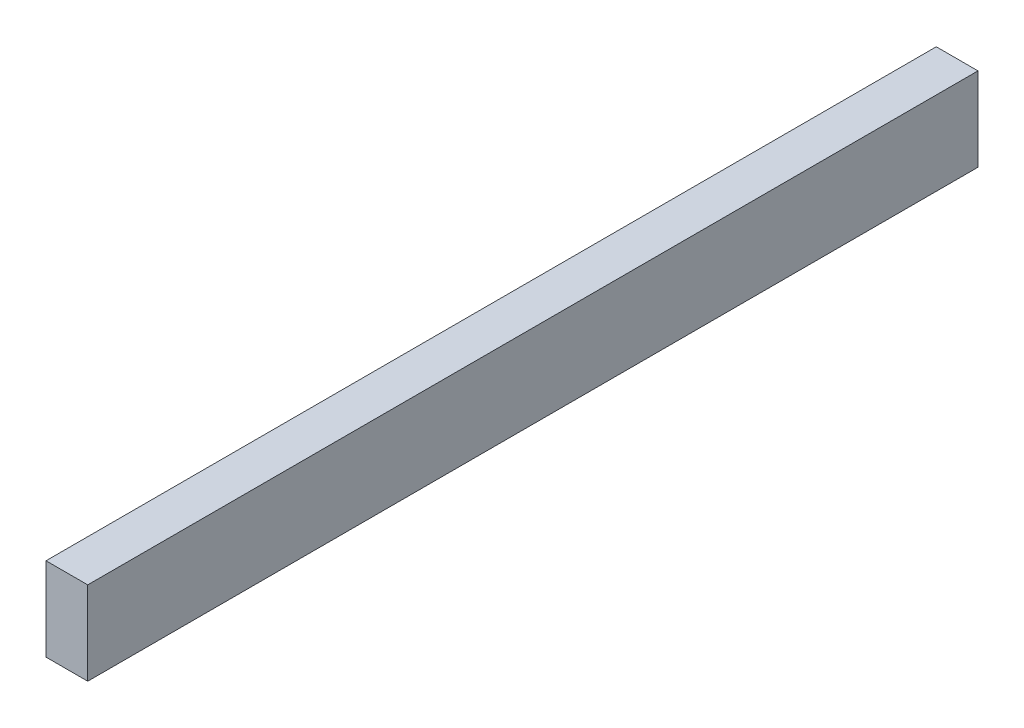
ISO-10303-21;
HEADER;
FILE_DESCRIPTION(('STEP AP214'),'2;1');
FILE_NAME('part.step','',(''),(''),'','','');
FILE_SCHEMA(('AUTOMOTIVE_DESIGN { 1 0 10303 214 1 1 1 1 }'));
ENDSEC;
DATA;
#1=APPLICATION_CONTEXT('core data for automotive mechanical design processes');
#2=APPLICATION_PROTOCOL_DEFINITION('international standard','automotive_design',2000,#1);
#3=PRODUCT_CONTEXT('',#1,'mechanical');
#4=PRODUCT('Part','Part','',(#3));
#5=PRODUCT_RELATED_PRODUCT_CATEGORY('part','',(#4));
#6=PRODUCT_DEFINITION_FORMATION('','',#4);
#7=PRODUCT_DEFINITION_CONTEXT('part definition',#1,'design');
#8=PRODUCT_DEFINITION('design','',#6,#7);
#9=PRODUCT_DEFINITION_SHAPE('','',#8);
#10=(LENGTH_UNIT() NAMED_UNIT(*) SI_UNIT(.MILLI.,.METRE.));
#11=(NAMED_UNIT(*) PLANE_ANGLE_UNIT() SI_UNIT($,.RADIAN.));
#12=(NAMED_UNIT(*) SI_UNIT($,.STERADIAN.) SOLID_ANGLE_UNIT());
#13=UNCERTAINTY_MEASURE_WITH_UNIT(LENGTH_MEASURE(1.E-05),#10,'distance_accuracy_value','');
#14=(GEOMETRIC_REPRESENTATION_CONTEXT(3) GLOBAL_UNCERTAINTY_ASSIGNED_CONTEXT((#13)) GLOBAL_UNIT_ASSIGNED_CONTEXT((#10,
#11,#12)) REPRESENTATION_CONTEXT('',''));
#15=CARTESIAN_POINT('',(0.,0.,0.));
#16=DIRECTION('',(0.,0.,1.));
#17=DIRECTION('',(1.,0.,0.));
#18=AXIS2_PLACEMENT_3D('',#15,#16,#17);
#19=CARTESIAN_POINT('',(15.,15.,-160.));
#20=DIRECTION('',(0.,0.,1.));
#21=DIRECTION('',(0.,-1.,0.));
#22=AXIS2_PLACEMENT_3D('',#19,#20,#21);
#23=PLANE('',#22);
#24=DIRECTION('',(0.,1.,0.));
#25=VECTOR('',#24,1.);
#26=CARTESIAN_POINT('',(0.,15.,-160.));
#27=LINE('',#26,#25);
#28=CARTESIAN_POINT('',(0.,-15.,-160.));
#29=VERTEX_POINT('',#28);
#30=CARTESIAN_POINT('',(0.,15.,-160.));
#31=VERTEX_POINT('',#30);
#32=EDGE_CURVE('E107',#29,#31,#27,.T.);
#33=ORIENTED_EDGE('',*,*,#32,.T.);
#34=DIRECTION('',(-1.,0.,0.));
#35=VECTOR('',#34,1.);
#36=CARTESIAN_POINT('',(15.,15.,-160.));
#37=LINE('',#36,#35);
#38=CARTESIAN_POINT('',(15.,15.,-160.));
#39=VERTEX_POINT('',#38);
#40=EDGE_CURVE('E11',#39,#31,#37,.T.);
#41=ORIENTED_EDGE('',*,*,#40,.F.);
#42=DIRECTION('',(0.,1.,0.));
#43=VECTOR('',#42,1.);
#44=CARTESIAN_POINT('',(15.,15.,-160.));
#45=LINE('',#44,#43);
#46=CARTESIAN_POINT('',(15.,-15.,-160.));
#47=VERTEX_POINT('',#46);
#48=EDGE_CURVE('E91',#47,#39,#45,.T.);
#49=ORIENTED_EDGE('',*,*,#48,.F.);
#50=DIRECTION('',(-1.,0.,0.));
#51=VECTOR('',#50,1.);
#52=CARTESIAN_POINT('',(15.,-15.,-160.));
#53=LINE('',#52,#51);
#54=EDGE_CURVE('E103',#47,#29,#53,.T.);
#55=ORIENTED_EDGE('',*,*,#54,.T.);
#56=EDGE_LOOP('',(#33,#41,#49,#55));
#57=FACE_BOUND('',#56,.T.);
#58=ADVANCED_FACE('F39',(#57),#23,.F.);
#59=CARTESIAN_POINT('',(15.,15.,160.));
#60=DIRECTION('',(0.,-1.,0.));
#61=DIRECTION('',(0.,0.,-1.));
#62=AXIS2_PLACEMENT_3D('',#59,#60,#61);
#63=PLANE('',#62);
#64=DIRECTION('',(0.,0.,1.));
#65=VECTOR('',#64,1.);
#66=CARTESIAN_POINT('',(0.,15.,160.));
#67=LINE('',#66,#65);
#68=CARTESIAN_POINT('',(0.,15.,160.));
#69=VERTEX_POINT('',#68);
#70=EDGE_CURVE('E96',#31,#69,#67,.T.);
#71=ORIENTED_EDGE('',*,*,#70,.T.);
#72=DIRECTION('',(-1.,0.,0.));
#73=VECTOR('',#72,1.);
#74=CARTESIAN_POINT('',(15.,15.,160.));
#75=LINE('',#74,#73);
#76=CARTESIAN_POINT('',(15.,15.,160.));
#77=VERTEX_POINT('',#76);
#78=EDGE_CURVE('E48',#77,#69,#75,.T.);
#79=ORIENTED_EDGE('',*,*,#78,.F.);
#80=DIRECTION('',(0.,0.,1.));
#81=VECTOR('',#80,1.);
#82=CARTESIAN_POINT('',(15.,15.,160.));
#83=LINE('',#82,#81);
#84=EDGE_CURVE('E86',#39,#77,#83,.T.);
#85=ORIENTED_EDGE('',*,*,#84,.F.);
#86=ORIENTED_EDGE('',*,*,#40,.T.);
#87=EDGE_LOOP('',(#71,#79,#85,#86));
#88=FACE_BOUND('',#87,.T.);
#89=ADVANCED_FACE('F95',(#88),#63,.F.);
#90=CARTESIAN_POINT('',(15.,15.,160.));
#91=DIRECTION('',(0.,0.,-1.));
#92=DIRECTION('',(0.,1.,0.));
#93=AXIS2_PLACEMENT_3D('',#90,#91,#92);
#94=PLANE('',#93);
#95=DIRECTION('',(0.,-1.,0.));
#96=VECTOR('',#95,1.);
#97=CARTESIAN_POINT('',(0.,15.,160.));
#98=LINE('',#97,#96);
#99=CARTESIAN_POINT('',(0.,-15.,160.));
#100=VERTEX_POINT('',#99);
#101=EDGE_CURVE('E73',#69,#100,#98,.T.);
#102=ORIENTED_EDGE('',*,*,#101,.T.);
#103=DIRECTION('',(-1.,0.,0.));
#104=VECTOR('',#103,1.);
#105=CARTESIAN_POINT('',(15.,-15.,160.));
#106=LINE('',#105,#104);
#107=CARTESIAN_POINT('',(15.,-15.,160.));
#108=VERTEX_POINT('',#107);
#109=EDGE_CURVE('E98',#108,#100,#106,.T.);
#110=ORIENTED_EDGE('',*,*,#109,.F.);
#111=DIRECTION('',(0.,-1.,0.));
#112=VECTOR('',#111,1.);
#113=CARTESIAN_POINT('',(15.,15.,160.));
#114=LINE('',#113,#112);
#115=EDGE_CURVE('E89',#77,#108,#114,.T.);
#116=ORIENTED_EDGE('',*,*,#115,.F.);
#117=ORIENTED_EDGE('',*,*,#78,.T.);
#118=EDGE_LOOP('',(#102,#110,#116,#117));
#119=FACE_BOUND('',#118,.T.);
#120=ADVANCED_FACE('F99',(#119),#94,.F.);
#121=CARTESIAN_POINT('',(15.,-15.,160.));
#122=DIRECTION('',(0.,1.,0.));
#123=DIRECTION('',(0.,0.,1.));
#124=AXIS2_PLACEMENT_3D('',#121,#122,#123);
#125=PLANE('',#124);
#126=DIRECTION('',(0.,0.,-1.));
#127=VECTOR('',#126,1.);
#128=CARTESIAN_POINT('',(0.,-15.,160.));
#129=LINE('',#128,#127);
#130=EDGE_CURVE('E79',#100,#29,#129,.T.);
#131=ORIENTED_EDGE('',*,*,#130,.T.);
#132=ORIENTED_EDGE('',*,*,#54,.F.);
#133=DIRECTION('',(0.,0.,-1.));
#134=VECTOR('',#133,1.);
#135=CARTESIAN_POINT('',(15.,-15.,160.));
#136=LINE('',#135,#134);
#137=EDGE_CURVE('E56',#108,#47,#136,.T.);
#138=ORIENTED_EDGE('',*,*,#137,.F.);
#139=ORIENTED_EDGE('',*,*,#109,.T.);
#140=EDGE_LOOP('',(#131,#132,#138,#139));
#141=FACE_BOUND('',#140,.T.);
#142=ADVANCED_FACE('F120',(#141),#125,.F.);
#143=CARTESIAN_POINT('',(15.,0.,0.));
#144=DIRECTION('',(1.,0.,0.));
#145=DIRECTION('',(0.,0.,-1.));
#146=AXIS2_PLACEMENT_3D('',#143,#144,#145);
#147=PLANE('',#146);
#148=ORIENTED_EDGE('',*,*,#48,.T.);
#149=ORIENTED_EDGE('',*,*,#84,.T.);
#150=ORIENTED_EDGE('',*,*,#115,.T.);
#151=ORIENTED_EDGE('',*,*,#137,.T.);
#152=EDGE_LOOP('',(#148,#149,#150,#151));
#153=FACE_BOUND('',#152,.T.);
#154=ADVANCED_FACE('F87',(#153),#147,.T.);
#155=CARTESIAN_POINT('',(0.,0.,0.));
#156=DIRECTION('',(1.,0.,0.));
#157=DIRECTION('',(0.,0.,-1.));
#158=AXIS2_PLACEMENT_3D('',#155,#156,#157);
#159=PLANE('',#158);
#160=ORIENTED_EDGE('',*,*,#32,.F.);
#161=ORIENTED_EDGE('',*,*,#130,.F.);
#162=ORIENTED_EDGE('',*,*,#101,.F.);
#163=ORIENTED_EDGE('',*,*,#70,.F.);
#164=EDGE_LOOP('',(#160,#161,#162,#163));
#165=FACE_BOUND('',#164,.T.);
#166=ADVANCED_FACE('F123',(#165),#159,.F.);
#167=CLOSED_SHELL('',(#58,#89,#120,#142,#154,#166));
#168=MANIFOLD_SOLID_BREP('B2',#167);
#169=ADVANCED_BREP_SHAPE_REPRESENTATION('',(#18,#168),#14);
#170=SHAPE_DEFINITION_REPRESENTATION(#9,#169);
ENDSEC;
END-ISO-10303-21;
